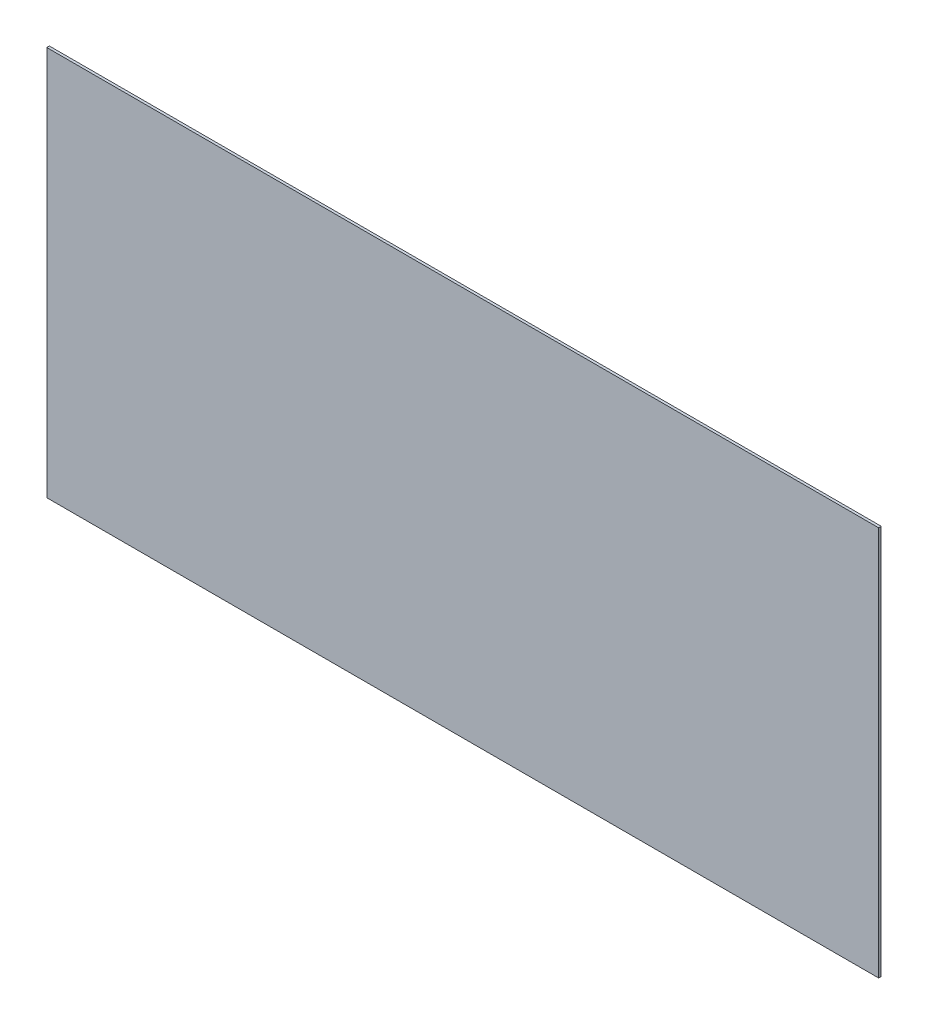
ISO-10303-21;
HEADER;
FILE_DESCRIPTION(('STEP AP214'),'2;1');
FILE_NAME('part.step','',(''),(''),'','','');
FILE_SCHEMA(('AUTOMOTIVE_DESIGN { 1 0 10303 214 1 1 1 1 }'));
ENDSEC;
DATA;
#1=APPLICATION_CONTEXT('core data for automotive mechanical design processes');
#2=APPLICATION_PROTOCOL_DEFINITION('international standard','automotive_design',2000,#1);
#3=PRODUCT_CONTEXT('',#1,'mechanical');
#4=PRODUCT('Part','Part','',(#3));
#5=PRODUCT_RELATED_PRODUCT_CATEGORY('part','',(#4));
#6=PRODUCT_DEFINITION_FORMATION('','',#4);
#7=PRODUCT_DEFINITION_CONTEXT('part definition',#1,'design');
#8=PRODUCT_DEFINITION('design','',#6,#7);
#9=PRODUCT_DEFINITION_SHAPE('','',#8);
#10=(LENGTH_UNIT() NAMED_UNIT(*) SI_UNIT(.MILLI.,.METRE.));
#11=(NAMED_UNIT(*) PLANE_ANGLE_UNIT() SI_UNIT($,.RADIAN.));
#12=(NAMED_UNIT(*) SI_UNIT($,.STERADIAN.) SOLID_ANGLE_UNIT());
#13=UNCERTAINTY_MEASURE_WITH_UNIT(LENGTH_MEASURE(1.E-05),#10,'distance_accuracy_value','');
#14=(GEOMETRIC_REPRESENTATION_CONTEXT(3) GLOBAL_UNCERTAINTY_ASSIGNED_CONTEXT((#13)) GLOBAL_UNIT_ASSIGNED_CONTEXT((#10,
#11,#12)) REPRESENTATION_CONTEXT('',''));
#15=CARTESIAN_POINT('',(0.,0.,0.));
#16=DIRECTION('',(0.,0.,1.));
#17=DIRECTION('',(1.,0.,0.));
#18=AXIS2_PLACEMENT_3D('',#15,#16,#17);
#19=CARTESIAN_POINT('',(0.,0.,2.));
#20=DIRECTION('',(1.,0.,0.));
#21=DIRECTION('',(0.,1.,0.));
#22=AXIS2_PLACEMENT_3D('',#19,#20,#21);
#23=PLANE('',#22);
#24=DIRECTION('',(0.,-1.,0.));
#25=VECTOR('',#24,1.);
#26=CARTESIAN_POINT('',(0.,0.,0.));
#27=LINE('',#26,#25);
#28=CARTESIAN_POINT('',(0.,0.,0.));
#29=VERTEX_POINT('',#28);
#30=CARTESIAN_POINT('',(0.,-300.,0.));
#31=VERTEX_POINT('',#30);
#32=EDGE_CURVE('E96',#29,#31,#27,.T.);
#33=ORIENTED_EDGE('',*,*,#32,.T.);
#34=DIRECTION('',(0.,0.,-1.));
#35=VECTOR('',#34,1.);
#36=CARTESIAN_POINT('',(0.,-300.,2.));
#37=LINE('',#36,#35);
#38=CARTESIAN_POINT('',(0.,-300.,2.));
#39=VERTEX_POINT('',#38);
#40=EDGE_CURVE('E11',#39,#31,#37,.T.);
#41=ORIENTED_EDGE('',*,*,#40,.F.);
#42=DIRECTION('',(0.,-1.,0.));
#43=VECTOR('',#42,1.);
#44=CARTESIAN_POINT('',(0.,0.,2.));
#45=LINE('',#44,#43);
#46=CARTESIAN_POINT('',(0.,0.,2.));
#47=VERTEX_POINT('',#46);
#48=EDGE_CURVE('E84',#47,#39,#45,.T.);
#49=ORIENTED_EDGE('',*,*,#48,.F.);
#50=DIRECTION('',(0.,0.,-1.));
#51=VECTOR('',#50,1.);
#52=CARTESIAN_POINT('',(0.,0.,2.));
#53=LINE('',#52,#51);
#54=EDGE_CURVE('E92',#47,#29,#53,.T.);
#55=ORIENTED_EDGE('',*,*,#54,.T.);
#56=EDGE_LOOP('',(#33,#41,#49,#55));
#57=FACE_BOUND('',#56,.T.);
#58=ADVANCED_FACE('F33',(#57),#23,.F.);
#59=CARTESIAN_POINT('',(0.,-300.,2.));
#60=DIRECTION('',(0.,1.,0.));
#61=DIRECTION('',(0.,0.,1.));
#62=AXIS2_PLACEMENT_3D('',#59,#60,#61);
#63=PLANE('',#62);
#64=DIRECTION('',(1.,0.,0.));
#65=VECTOR('',#64,1.);
#66=CARTESIAN_POINT('',(0.,-300.,0.));
#67=LINE('',#66,#65);
#68=CARTESIAN_POINT('',(640.,-300.,0.));
#69=VERTEX_POINT('',#68);
#70=EDGE_CURVE('E88',#31,#69,#67,.T.);
#71=ORIENTED_EDGE('',*,*,#70,.T.);
#72=DIRECTION('',(0.,0.,-1.));
#73=VECTOR('',#72,1.);
#74=CARTESIAN_POINT('',(640.,-300.,2.));
#75=LINE('',#74,#73);
#76=CARTESIAN_POINT('',(640.,-300.,2.));
#77=VERTEX_POINT('',#76);
#78=EDGE_CURVE('E41',#77,#69,#75,.T.);
#79=ORIENTED_EDGE('',*,*,#78,.F.);
#80=DIRECTION('',(1.,0.,0.));
#81=VECTOR('',#80,1.);
#82=CARTESIAN_POINT('',(0.,-300.,2.));
#83=LINE('',#82,#81);
#84=EDGE_CURVE('E79',#39,#77,#83,.T.);
#85=ORIENTED_EDGE('',*,*,#84,.F.);
#86=ORIENTED_EDGE('',*,*,#40,.T.);
#87=EDGE_LOOP('',(#71,#79,#85,#86));
#88=FACE_BOUND('',#87,.T.);
#89=ADVANCED_FACE('F87',(#88),#63,.F.);
#90=CARTESIAN_POINT('',(640.,0.,2.));
#91=DIRECTION('',(-1.,0.,0.));
#92=DIRECTION('',(0.,0.,1.));
#93=AXIS2_PLACEMENT_3D('',#90,#91,#92);
#94=PLANE('',#93);
#95=DIRECTION('',(0.,1.,0.));
#96=VECTOR('',#95,1.);
#97=CARTESIAN_POINT('',(640.,0.,0.));
#98=LINE('',#97,#96);
#99=CARTESIAN_POINT('',(640.,0.,0.));
#100=VERTEX_POINT('',#99);
#101=EDGE_CURVE('E66',#69,#100,#98,.T.);
#102=ORIENTED_EDGE('',*,*,#101,.T.);
#103=DIRECTION('',(0.,0.,-1.));
#104=VECTOR('',#103,1.);
#105=CARTESIAN_POINT('',(640.,0.,2.));
#106=LINE('',#105,#104);
#107=CARTESIAN_POINT('',(640.,0.,2.));
#108=VERTEX_POINT('',#107);
#109=EDGE_CURVE('E89',#108,#100,#106,.T.);
#110=ORIENTED_EDGE('',*,*,#109,.F.);
#111=DIRECTION('',(0.,1.,0.));
#112=VECTOR('',#111,1.);
#113=CARTESIAN_POINT('',(640.,0.,2.));
#114=LINE('',#113,#112);
#115=EDGE_CURVE('E82',#77,#108,#114,.T.);
#116=ORIENTED_EDGE('',*,*,#115,.F.);
#117=ORIENTED_EDGE('',*,*,#78,.T.);
#118=EDGE_LOOP('',(#102,#110,#116,#117));
#119=FACE_BOUND('',#118,.T.);
#120=ADVANCED_FACE('F90',(#119),#94,.F.);
#121=CARTESIAN_POINT('',(0.,0.,2.));
#122=DIRECTION('',(0.,-1.,0.));
#123=DIRECTION('',(0.,0.,-1.));
#124=AXIS2_PLACEMENT_3D('',#121,#122,#123);
#125=PLANE('',#124);
#126=DIRECTION('',(-1.,0.,0.));
#127=VECTOR('',#126,1.);
#128=CARTESIAN_POINT('',(0.,0.,0.));
#129=LINE('',#128,#127);
#130=EDGE_CURVE('E72',#100,#29,#129,.T.);
#131=ORIENTED_EDGE('',*,*,#130,.T.);
#132=ORIENTED_EDGE('',*,*,#54,.F.);
#133=DIRECTION('',(-1.,0.,0.));
#134=VECTOR('',#133,1.);
#135=CARTESIAN_POINT('',(0.,0.,2.));
#136=LINE('',#135,#134);
#137=EDGE_CURVE('E49',#108,#47,#136,.T.);
#138=ORIENTED_EDGE('',*,*,#137,.F.);
#139=ORIENTED_EDGE('',*,*,#109,.T.);
#140=EDGE_LOOP('',(#131,#132,#138,#139));
#141=FACE_BOUND('',#140,.T.);
#142=ADVANCED_FACE('F103',(#141),#125,.F.);
#143=CARTESIAN_POINT('',(0.,0.,2.));
#144=DIRECTION('',(0.,0.,1.));
#145=DIRECTION('',(1.,0.,0.));
#146=AXIS2_PLACEMENT_3D('',#143,#144,#145);
#147=PLANE('',#146);
#148=ORIENTED_EDGE('',*,*,#48,.T.);
#149=ORIENTED_EDGE('',*,*,#84,.T.);
#150=ORIENTED_EDGE('',*,*,#115,.T.);
#151=ORIENTED_EDGE('',*,*,#137,.T.);
#152=EDGE_LOOP('',(#148,#149,#150,#151));
#153=FACE_BOUND('',#152,.T.);
#154=ADVANCED_FACE('F80',(#153),#147,.T.);
#155=CARTESIAN_POINT('',(0.,0.,0.));
#156=DIRECTION('',(0.,0.,1.));
#157=DIRECTION('',(1.,0.,0.));
#158=AXIS2_PLACEMENT_3D('',#155,#156,#157);
#159=PLANE('',#158);
#160=ORIENTED_EDGE('',*,*,#32,.F.);
#161=ORIENTED_EDGE('',*,*,#130,.F.);
#162=ORIENTED_EDGE('',*,*,#101,.F.);
#163=ORIENTED_EDGE('',*,*,#70,.F.);
#164=EDGE_LOOP('',(#160,#161,#162,#163));
#165=FACE_BOUND('',#164,.T.);
#166=ADVANCED_FACE('F106',(#165),#159,.F.);
#167=CLOSED_SHELL('',(#58,#89,#120,#142,#154,#166));
#168=MANIFOLD_SOLID_BREP('B2',#167);
#169=ADVANCED_BREP_SHAPE_REPRESENTATION('',(#18,#168),#14);
#170=SHAPE_DEFINITION_REPRESENTATION(#9,#169);
ENDSEC;
END-ISO-10303-21;
